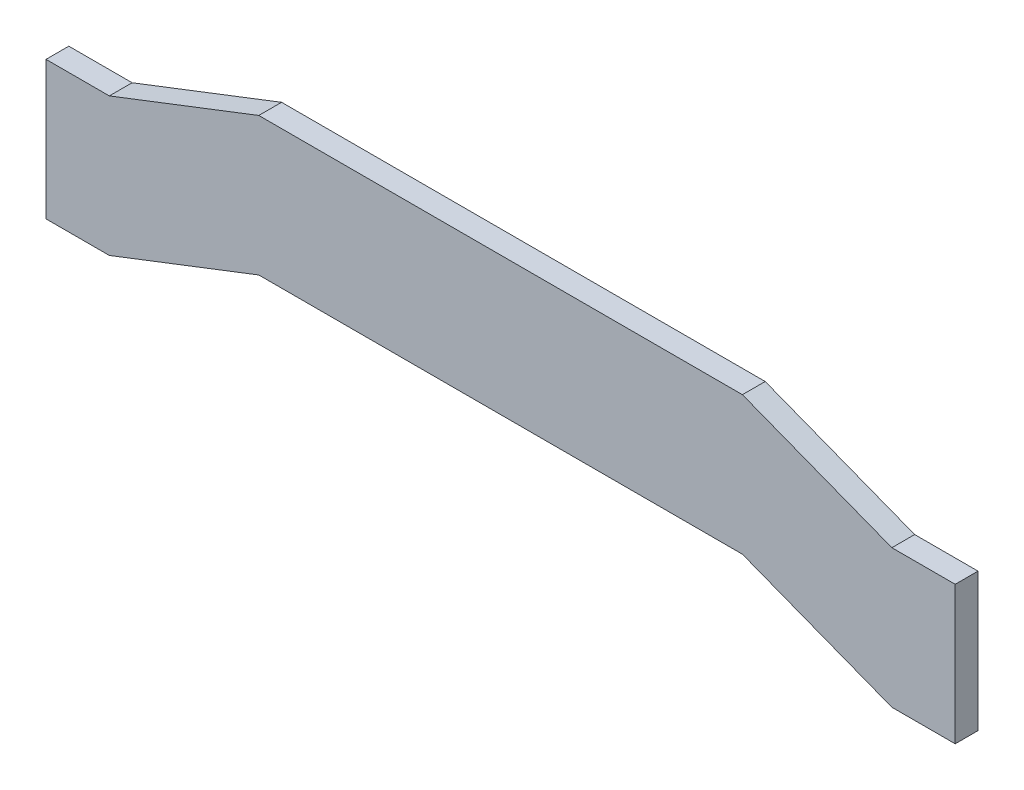
ISO-10303-21;
HEADER;
FILE_DESCRIPTION(('STEP AP214'),'2;1');
FILE_NAME('part.step','',(''),(''),'','','');
FILE_SCHEMA(('AUTOMOTIVE_DESIGN { 1 0 10303 214 1 1 1 1 }'));
ENDSEC;
DATA;
#1=APPLICATION_CONTEXT('core data for automotive mechanical design processes');
#2=APPLICATION_PROTOCOL_DEFINITION('international standard','automotive_design',2000,#1);
#3=PRODUCT_CONTEXT('',#1,'mechanical');
#4=PRODUCT('Part','Part','',(#3));
#5=PRODUCT_RELATED_PRODUCT_CATEGORY('part','',(#4));
#6=PRODUCT_DEFINITION_FORMATION('','',#4);
#7=PRODUCT_DEFINITION_CONTEXT('part definition',#1,'design');
#8=PRODUCT_DEFINITION('design','',#6,#7);
#9=PRODUCT_DEFINITION_SHAPE('','',#8);
#10=(LENGTH_UNIT() NAMED_UNIT(*) SI_UNIT(.MILLI.,.METRE.));
#11=(NAMED_UNIT(*) PLANE_ANGLE_UNIT() SI_UNIT($,.RADIAN.));
#12=(NAMED_UNIT(*) SI_UNIT($,.STERADIAN.) SOLID_ANGLE_UNIT());
#13=UNCERTAINTY_MEASURE_WITH_UNIT(LENGTH_MEASURE(1.E-05),#10,'distance_accuracy_value','');
#14=(GEOMETRIC_REPRESENTATION_CONTEXT(3) GLOBAL_UNCERTAINTY_ASSIGNED_CONTEXT((#13)) GLOBAL_UNIT_ASSIGNED_CONTEXT((#10,
#11,#12)) REPRESENTATION_CONTEXT('',''));
#15=CARTESIAN_POINT('',(0.,0.,0.));
#16=DIRECTION('',(0.,0.,1.));
#17=DIRECTION('',(1.,0.,0.));
#18=AXIS2_PLACEMENT_3D('',#15,#16,#17);
#19=CARTESIAN_POINT('',(-339.8,19.8,19.8));
#20=DIRECTION('',(-0.360711868380704,0.932677301111859,0.));
#21=DIRECTION('',(-0.932677301111859,-0.360711868380704,0.));
#22=AXIS2_PLACEMENT_3D('',#19,#20,#21);
#23=PLANE('',#22);
#24=DIRECTION('',(0.932677301111859,0.360711868380704,0.));
#25=VECTOR('',#24,1.);
#26=CARTESIAN_POINT('',(-339.8,19.8,0.));
#27=LINE('',#26,#25);
#28=CARTESIAN_POINT('',(-339.8,19.8,0.));
#29=VERTEX_POINT('',#28);
#30=CARTESIAN_POINT('',(-210.,70.,0.));
#31=VERTEX_POINT('',#30);
#32=EDGE_CURVE('E168',#29,#31,#27,.T.);
#33=ORIENTED_EDGE('',*,*,#32,.T.);
#34=DIRECTION('',(0.,0.,-1.));
#35=VECTOR('',#34,1.);
#36=CARTESIAN_POINT('',(-210.,70.,19.8));
#37=LINE('',#36,#35);
#38=CARTESIAN_POINT('',(-210.,70.,19.8));
#39=VERTEX_POINT('',#38);
#40=EDGE_CURVE('E11',#39,#31,#37,.T.);
#41=ORIENTED_EDGE('',*,*,#40,.F.);
#42=DIRECTION('',(0.932677301111859,0.360711868380704,0.));
#43=VECTOR('',#42,1.);
#44=CARTESIAN_POINT('',(-339.8,19.8,19.8));
#45=LINE('',#44,#43);
#46=CARTESIAN_POINT('',(-339.8,19.8,19.8));
#47=VERTEX_POINT('',#46);
#48=EDGE_CURVE('E202',#47,#39,#45,.T.);
#49=ORIENTED_EDGE('',*,*,#48,.F.);
#50=DIRECTION('',(0.,0.,-1.));
#51=VECTOR('',#50,1.);
#52=CARTESIAN_POINT('',(-339.8,19.8,19.8));
#53=LINE('',#52,#51);
#54=EDGE_CURVE('E164',#47,#29,#53,.T.);
#55=ORIENTED_EDGE('',*,*,#54,.T.);
#56=EDGE_LOOP('',(#33,#41,#49,#55));
#57=FACE_BOUND('',#56,.T.);
#58=ADVANCED_FACE('F43',(#57),#23,.F.);
#59=CARTESIAN_POINT('',(-210.,70.,19.8));
#60=DIRECTION('',(0.,1.,0.));
#61=DIRECTION('',(-1.,0.,0.));
#62=AXIS2_PLACEMENT_3D('',#59,#60,#61);
#63=PLANE('',#62);
#64=DIRECTION('',(1.,0.,0.));
#65=VECTOR('',#64,1.);
#66=CARTESIAN_POINT('',(-210.,70.,0.));
#67=LINE('',#66,#65);
#68=CARTESIAN_POINT('',(210.,70.0000000000001,0.));
#69=VERTEX_POINT('',#68);
#70=EDGE_CURVE('E172',#31,#69,#67,.T.);
#71=ORIENTED_EDGE('',*,*,#70,.T.);
#72=DIRECTION('',(0.,0.,-1.));
#73=VECTOR('',#72,1.);
#74=CARTESIAN_POINT('',(210.,70.0000000000001,19.8));
#75=LINE('',#74,#73);
#76=CARTESIAN_POINT('',(210.,70.0000000000001,19.8));
#77=VERTEX_POINT('',#76);
#78=EDGE_CURVE('E52',#77,#69,#75,.T.);
#79=ORIENTED_EDGE('',*,*,#78,.F.);
#80=DIRECTION('',(1.,0.,0.));
#81=VECTOR('',#80,1.);
#82=CARTESIAN_POINT('',(-210.,70.,19.8));
#83=LINE('',#82,#81);
#84=EDGE_CURVE('E115',#39,#77,#83,.T.);
#85=ORIENTED_EDGE('',*,*,#84,.F.);
#86=ORIENTED_EDGE('',*,*,#40,.T.);
#87=EDGE_LOOP('',(#71,#79,#85,#86));
#88=FACE_BOUND('',#87,.T.);
#89=ADVANCED_FACE('F296',(#88),#63,.F.);
#90=CARTESIAN_POINT('',(339.8,19.8,19.8));
#91=DIRECTION('',(0.360711868380704,0.932677301111859,0.));
#92=DIRECTION('',(-0.932677301111859,0.360711868380704,0.));
#93=AXIS2_PLACEMENT_3D('',#90,#91,#92);
#94=PLANE('',#93);
#95=DIRECTION('',(0.932677301111859,-0.360711868380704,0.));
#96=VECTOR('',#95,1.);
#97=CARTESIAN_POINT('',(339.8,19.8,0.));
#98=LINE('',#97,#96);
#99=CARTESIAN_POINT('',(339.8,19.8,0.));
#100=VERTEX_POINT('',#99);
#101=EDGE_CURVE('E175',#69,#100,#98,.T.);
#102=ORIENTED_EDGE('',*,*,#101,.T.);
#103=DIRECTION('',(0.,0.,-1.));
#104=VECTOR('',#103,1.);
#105=CARTESIAN_POINT('',(339.8,19.8,19.8));
#106=LINE('',#105,#104);
#107=CARTESIAN_POINT('',(339.8,19.8,19.8));
#108=VERTEX_POINT('',#107);
#109=EDGE_CURVE('E229',#108,#100,#106,.T.);
#110=ORIENTED_EDGE('',*,*,#109,.F.);
#111=DIRECTION('',(0.932677301111859,-0.360711868380704,0.));
#112=VECTOR('',#111,1.);
#113=CARTESIAN_POINT('',(339.8,19.8,19.8));
#114=LINE('',#113,#112);
#115=EDGE_CURVE('E239',#77,#108,#114,.T.);
#116=ORIENTED_EDGE('',*,*,#115,.F.);
#117=ORIENTED_EDGE('',*,*,#78,.T.);
#118=EDGE_LOOP('',(#102,#110,#116,#117));
#119=FACE_BOUND('',#118,.T.);
#120=ADVANCED_FACE('F237',(#119),#94,.F.);
#121=CARTESIAN_POINT('',(394.8,19.8,19.8));
#122=DIRECTION('',(0.,1.,0.));
#123=DIRECTION('',(-1.,0.,0.));
#124=AXIS2_PLACEMENT_3D('',#121,#122,#123);
#125=PLANE('',#124);
#126=DIRECTION('',(1.,0.,0.));
#127=VECTOR('',#126,1.);
#128=CARTESIAN_POINT('',(394.8,19.8,0.));
#129=LINE('',#128,#127);
#130=CARTESIAN_POINT('',(394.8,19.8,0.));
#131=VERTEX_POINT('',#130);
#132=EDGE_CURVE('E178',#100,#131,#129,.T.);
#133=ORIENTED_EDGE('',*,*,#132,.T.);
#134=DIRECTION('',(0.,0.,-1.));
#135=VECTOR('',#134,1.);
#136=CARTESIAN_POINT('',(394.8,19.8,19.8));
#137=LINE('',#136,#135);
#138=CARTESIAN_POINT('',(394.8,19.8,19.8));
#139=VERTEX_POINT('',#138);
#140=EDGE_CURVE('E225',#139,#131,#137,.T.);
#141=ORIENTED_EDGE('',*,*,#140,.F.);
#142=DIRECTION('',(1.,0.,0.));
#143=VECTOR('',#142,1.);
#144=CARTESIAN_POINT('',(394.8,19.8,19.8));
#145=LINE('',#144,#143);
#146=EDGE_CURVE('E258',#108,#139,#145,.T.);
#147=ORIENTED_EDGE('',*,*,#146,.F.);
#148=ORIENTED_EDGE('',*,*,#109,.T.);
#149=EDGE_LOOP('',(#133,#141,#147,#148));
#150=FACE_BOUND('',#149,.T.);
#151=ADVANCED_FACE('F248',(#150),#125,.F.);
#152=CARTESIAN_POINT('',(394.8,19.8,19.8));
#153=DIRECTION('',(-1.,0.,0.));
#154=DIRECTION('',(0.,-1.,0.));
#155=AXIS2_PLACEMENT_3D('',#152,#153,#154);
#156=PLANE('',#155);
#157=DIRECTION('',(0.,1.,0.));
#158=VECTOR('',#157,1.);
#159=CARTESIAN_POINT('',(394.8,19.8,0.));
#160=LINE('',#159,#158);
#161=CARTESIAN_POINT('',(394.8,139.8,0.));
#162=VERTEX_POINT('',#161);
#163=EDGE_CURVE('E181',#131,#162,#160,.T.);
#164=ORIENTED_EDGE('',*,*,#163,.T.);
#165=DIRECTION('',(0.,0.,-1.));
#166=VECTOR('',#165,1.);
#167=CARTESIAN_POINT('',(394.8,139.8,19.8));
#168=LINE('',#167,#166);
#169=CARTESIAN_POINT('',(394.8,139.8,19.8));
#170=VERTEX_POINT('',#169);
#171=EDGE_CURVE('E221',#170,#162,#168,.T.);
#172=ORIENTED_EDGE('',*,*,#171,.F.);
#173=DIRECTION('',(0.,1.,0.));
#174=VECTOR('',#173,1.);
#175=CARTESIAN_POINT('',(394.8,19.8,19.8));
#176=LINE('',#175,#174);
#177=EDGE_CURVE('E254',#139,#170,#176,.T.);
#178=ORIENTED_EDGE('',*,*,#177,.F.);
#179=ORIENTED_EDGE('',*,*,#140,.T.);
#180=EDGE_LOOP('',(#164,#172,#178,#179));
#181=FACE_BOUND('',#180,.T.);
#182=ADVANCED_FACE('F252',(#181),#156,.F.);
#183=CARTESIAN_POINT('',(394.8,139.8,19.8));
#184=DIRECTION('',(0.,-1.,0.));
#185=DIRECTION('',(1.,0.,0.));
#186=AXIS2_PLACEMENT_3D('',#183,#184,#185);
#187=PLANE('',#186);
#188=DIRECTION('',(-1.,0.,0.));
#189=VECTOR('',#188,1.);
#190=CARTESIAN_POINT('',(394.8,139.8,0.));
#191=LINE('',#190,#189);
#192=CARTESIAN_POINT('',(339.8,139.8,0.));
#193=VERTEX_POINT('',#192);
#194=EDGE_CURVE('E184',#162,#193,#191,.T.);
#195=ORIENTED_EDGE('',*,*,#194,.T.);
#196=DIRECTION('',(0.,0.,-1.));
#197=VECTOR('',#196,1.);
#198=CARTESIAN_POINT('',(339.8,139.8,19.8));
#199=LINE('',#198,#197);
#200=CARTESIAN_POINT('',(339.8,139.8,19.8));
#201=VERTEX_POINT('',#200);
#202=EDGE_CURVE('E217',#201,#193,#199,.T.);
#203=ORIENTED_EDGE('',*,*,#202,.F.);
#204=DIRECTION('',(-1.,0.,0.));
#205=VECTOR('',#204,1.);
#206=CARTESIAN_POINT('',(394.8,139.8,19.8));
#207=LINE('',#206,#205);
#208=EDGE_CURVE('E257',#170,#201,#207,.T.);
#209=ORIENTED_EDGE('',*,*,#208,.F.);
#210=ORIENTED_EDGE('',*,*,#171,.T.);
#211=EDGE_LOOP('',(#195,#203,#209,#210));
#212=FACE_BOUND('',#211,.T.);
#213=ADVANCED_FACE('F309',(#212),#187,.F.);
#214=CARTESIAN_POINT('',(339.8,139.8,19.8));
#215=DIRECTION('',(-0.360711868380705,-0.932677301111859,0.));
#216=DIRECTION('',(0.932677301111859,-0.360711868380705,0.));
#217=AXIS2_PLACEMENT_3D('',#214,#215,#216);
#218=PLANE('',#217);
#219=DIRECTION('',(-0.932677301111859,0.360711868380705,0.));
#220=VECTOR('',#219,1.);
#221=CARTESIAN_POINT('',(339.8,139.8,0.));
#222=LINE('',#221,#220);
#223=CARTESIAN_POINT('',(210.,190.,0.));
#224=VERTEX_POINT('',#223);
#225=EDGE_CURVE('E187',#193,#224,#222,.T.);
#226=ORIENTED_EDGE('',*,*,#225,.T.);
#227=DIRECTION('',(0.,0.,-1.));
#228=VECTOR('',#227,1.);
#229=CARTESIAN_POINT('',(210.,190.,19.8));
#230=LINE('',#229,#228);
#231=CARTESIAN_POINT('',(210.,190.,19.8));
#232=VERTEX_POINT('',#231);
#233=EDGE_CURVE('E213',#232,#224,#230,.T.);
#234=ORIENTED_EDGE('',*,*,#233,.F.);
#235=DIRECTION('',(-0.932677301111859,0.360711868380705,0.));
#236=VECTOR('',#235,1.);
#237=CARTESIAN_POINT('',(339.8,139.8,19.8));
#238=LINE('',#237,#236);
#239=EDGE_CURVE('E262',#201,#232,#238,.T.);
#240=ORIENTED_EDGE('',*,*,#239,.F.);
#241=ORIENTED_EDGE('',*,*,#202,.T.);
#242=EDGE_LOOP('',(#226,#234,#240,#241));
#243=FACE_BOUND('',#242,.T.);
#244=ADVANCED_FACE('F312',(#243),#218,.F.);
#245=CARTESIAN_POINT('',(210.,190.,19.8));
#246=DIRECTION('',(0.,-1.,0.));
#247=DIRECTION('',(1.,0.,0.));
#248=AXIS2_PLACEMENT_3D('',#245,#246,#247);
#249=PLANE('',#248);
#250=DIRECTION('',(-1.,0.,0.));
#251=VECTOR('',#250,1.);
#252=CARTESIAN_POINT('',(210.,190.,0.));
#253=LINE('',#252,#251);
#254=CARTESIAN_POINT('',(-210.,190.,0.));
#255=VERTEX_POINT('',#254);
#256=EDGE_CURVE('E190',#224,#255,#253,.T.);
#257=ORIENTED_EDGE('',*,*,#256,.T.);
#258=DIRECTION('',(0.,0.,-1.));
#259=VECTOR('',#258,1.);
#260=CARTESIAN_POINT('',(-210.,190.,19.8));
#261=LINE('',#260,#259);
#262=CARTESIAN_POINT('',(-210.,190.,19.8));
#263=VERTEX_POINT('',#262);
#264=EDGE_CURVE('E209',#263,#255,#261,.T.);
#265=ORIENTED_EDGE('',*,*,#264,.F.);
#266=DIRECTION('',(-1.,0.,0.));
#267=VECTOR('',#266,1.);
#268=CARTESIAN_POINT('',(210.,190.,19.8));
#269=LINE('',#268,#267);
#270=EDGE_CURVE('E269',#232,#263,#269,.T.);
#271=ORIENTED_EDGE('',*,*,#270,.F.);
#272=ORIENTED_EDGE('',*,*,#233,.T.);
#273=EDGE_LOOP('',(#257,#265,#271,#272));
#274=FACE_BOUND('',#273,.T.);
#275=ADVANCED_FACE('F277',(#274),#249,.F.);
#276=CARTESIAN_POINT('',(-339.8,139.8,19.8));
#277=DIRECTION('',(0.360711868380704,-0.932677301111859,0.));
#278=DIRECTION('',(0.932677301111859,0.360711868380704,0.));
#279=AXIS2_PLACEMENT_3D('',#276,#277,#278);
#280=PLANE('',#279);
#281=DIRECTION('',(-0.932677301111859,-0.360711868380704,0.));
#282=VECTOR('',#281,1.);
#283=CARTESIAN_POINT('',(-339.8,139.8,0.));
#284=LINE('',#283,#282);
#285=CARTESIAN_POINT('',(-339.8,139.8,0.));
#286=VERTEX_POINT('',#285);
#287=EDGE_CURVE('E193',#255,#286,#284,.T.);
#288=ORIENTED_EDGE('',*,*,#287,.T.);
#289=DIRECTION('',(0.,0.,-1.));
#290=VECTOR('',#289,1.);
#291=CARTESIAN_POINT('',(-339.8,139.8,19.8));
#292=LINE('',#291,#290);
#293=CARTESIAN_POINT('',(-339.8,139.8,19.8));
#294=VERTEX_POINT('',#293);
#295=EDGE_CURVE('E157',#294,#286,#292,.T.);
#296=ORIENTED_EDGE('',*,*,#295,.F.);
#297=DIRECTION('',(-0.932677301111859,-0.360711868380704,0.));
#298=VECTOR('',#297,1.);
#299=CARTESIAN_POINT('',(-339.8,139.8,19.8));
#300=LINE('',#299,#298);
#301=EDGE_CURVE('E146',#263,#294,#300,.T.);
#302=ORIENTED_EDGE('',*,*,#301,.F.);
#303=ORIENTED_EDGE('',*,*,#264,.T.);
#304=EDGE_LOOP('',(#288,#296,#302,#303));
#305=FACE_BOUND('',#304,.T.);
#306=ADVANCED_FACE('F281',(#305),#280,.F.);
#307=CARTESIAN_POINT('',(-394.8,139.8,19.8));
#308=DIRECTION('',(0.,-1.,0.));
#309=DIRECTION('',(0.,0.,-1.));
#310=AXIS2_PLACEMENT_3D('',#307,#308,#309);
#311=PLANE('',#310);
#312=DIRECTION('',(-1.,0.,0.));
#313=VECTOR('',#312,1.);
#314=CARTESIAN_POINT('',(-394.8,139.8,0.));
#315=LINE('',#314,#313);
#316=CARTESIAN_POINT('',(-394.8,139.8,0.));
#317=VERTEX_POINT('',#316);
#318=EDGE_CURVE('E155',#286,#317,#315,.T.);
#319=ORIENTED_EDGE('',*,*,#318,.T.);
#320=DIRECTION('',(0.,0.,-1.));
#321=VECTOR('',#320,1.);
#322=CARTESIAN_POINT('',(-394.8,139.8,19.8));
#323=LINE('',#322,#321);
#324=CARTESIAN_POINT('',(-394.8,139.8,19.8));
#325=VERTEX_POINT('',#324);
#326=EDGE_CURVE('E152',#325,#317,#323,.T.);
#327=ORIENTED_EDGE('',*,*,#326,.F.);
#328=DIRECTION('',(-1.,0.,0.));
#329=VECTOR('',#328,1.);
#330=CARTESIAN_POINT('',(-394.8,139.8,19.8));
#331=LINE('',#330,#329);
#332=EDGE_CURVE('E140',#294,#325,#331,.T.);
#333=ORIENTED_EDGE('',*,*,#332,.F.);
#334=ORIENTED_EDGE('',*,*,#295,.T.);
#335=EDGE_LOOP('',(#319,#327,#333,#334));
#336=FACE_BOUND('',#335,.T.);
#337=ADVANCED_FACE('F153',(#336),#311,.F.);
#338=CARTESIAN_POINT('',(-394.8,139.8,19.8));
#339=DIRECTION('',(1.,0.,0.));
#340=DIRECTION('',(0.,1.,0.));
#341=AXIS2_PLACEMENT_3D('',#338,#339,#340);
#342=PLANE('',#341);
#343=DIRECTION('',(0.,-1.,0.));
#344=VECTOR('',#343,1.);
#345=CARTESIAN_POINT('',(-394.8,139.8,0.));
#346=LINE('',#345,#344);
#347=CARTESIAN_POINT('',(-394.8,19.8,0.));
#348=VERTEX_POINT('',#347);
#349=EDGE_CURVE('E101',#317,#348,#346,.T.);
#350=ORIENTED_EDGE('',*,*,#349,.T.);
#351=DIRECTION('',(0.,0.,-1.));
#352=VECTOR('',#351,1.);
#353=CARTESIAN_POINT('',(-394.8,19.8,19.8));
#354=LINE('',#353,#352);
#355=CARTESIAN_POINT('',(-394.8,19.8,19.8));
#356=VERTEX_POINT('',#355);
#357=EDGE_CURVE('E158',#356,#348,#354,.T.);
#358=ORIENTED_EDGE('',*,*,#357,.F.);
#359=DIRECTION('',(0.,-1.,0.));
#360=VECTOR('',#359,1.);
#361=CARTESIAN_POINT('',(-394.8,139.8,19.8));
#362=LINE('',#361,#360);
#363=EDGE_CURVE('E144',#325,#356,#362,.T.);
#364=ORIENTED_EDGE('',*,*,#363,.F.);
#365=ORIENTED_EDGE('',*,*,#326,.T.);
#366=EDGE_LOOP('',(#350,#358,#364,#365));
#367=FACE_BOUND('',#366,.T.);
#368=ADVANCED_FACE('F160',(#367),#342,.F.);
#369=CARTESIAN_POINT('',(-394.8,19.8,19.8));
#370=DIRECTION('',(0.,1.,0.));
#371=DIRECTION('',(-1.,0.,0.));
#372=AXIS2_PLACEMENT_3D('',#369,#370,#371);
#373=PLANE('',#372);
#374=DIRECTION('',(1.,0.,0.));
#375=VECTOR('',#374,1.);
#376=CARTESIAN_POINT('',(-394.8,19.8,0.));
#377=LINE('',#376,#375);
#378=EDGE_CURVE('E107',#348,#29,#377,.T.);
#379=ORIENTED_EDGE('',*,*,#378,.T.);
#380=ORIENTED_EDGE('',*,*,#54,.F.);
#381=DIRECTION('',(1.,0.,0.));
#382=VECTOR('',#381,1.);
#383=CARTESIAN_POINT('',(-394.8,19.8,19.8));
#384=LINE('',#383,#382);
#385=EDGE_CURVE('E60',#356,#47,#384,.T.);
#386=ORIENTED_EDGE('',*,*,#385,.F.);
#387=ORIENTED_EDGE('',*,*,#357,.T.);
#388=EDGE_LOOP('',(#379,#380,#386,#387));
#389=FACE_BOUND('',#388,.T.);
#390=ADVANCED_FACE('F285',(#389),#373,.F.);
#391=CARTESIAN_POINT('',(0.,0.,19.8));
#392=DIRECTION('',(0.,0.,1.));
#393=DIRECTION('',(1.,0.,0.));
#394=AXIS2_PLACEMENT_3D('',#391,#392,#393);
#395=PLANE('',#394);
#396=ORIENTED_EDGE('',*,*,#48,.T.);
#397=ORIENTED_EDGE('',*,*,#84,.T.);
#398=ORIENTED_EDGE('',*,*,#115,.T.);
#399=ORIENTED_EDGE('',*,*,#146,.T.);
#400=ORIENTED_EDGE('',*,*,#177,.T.);
#401=ORIENTED_EDGE('',*,*,#208,.T.);
#402=ORIENTED_EDGE('',*,*,#239,.T.);
#403=ORIENTED_EDGE('',*,*,#270,.T.);
#404=ORIENTED_EDGE('',*,*,#301,.T.);
#405=ORIENTED_EDGE('',*,*,#332,.T.);
#406=ORIENTED_EDGE('',*,*,#363,.T.);
#407=ORIENTED_EDGE('',*,*,#385,.T.);
#408=EDGE_LOOP('',(#396,#397,#398,#399,#400,#401,#402,#403,#404,#405,#406,#407));
#409=FACE_BOUND('',#408,.T.);
#410=ADVANCED_FACE('F142',(#409),#395,.T.);
#411=CARTESIAN_POINT('',(0.,0.,0.));
#412=DIRECTION('',(0.,0.,1.));
#413=DIRECTION('',(1.,0.,0.));
#414=AXIS2_PLACEMENT_3D('',#411,#412,#413);
#415=PLANE('',#414);
#416=ORIENTED_EDGE('',*,*,#32,.F.);
#417=ORIENTED_EDGE('',*,*,#378,.F.);
#418=ORIENTED_EDGE('',*,*,#349,.F.);
#419=ORIENTED_EDGE('',*,*,#318,.F.);
#420=ORIENTED_EDGE('',*,*,#287,.F.);
#421=ORIENTED_EDGE('',*,*,#256,.F.);
#422=ORIENTED_EDGE('',*,*,#225,.F.);
#423=ORIENTED_EDGE('',*,*,#194,.F.);
#424=ORIENTED_EDGE('',*,*,#163,.F.);
#425=ORIENTED_EDGE('',*,*,#132,.F.);
#426=ORIENTED_EDGE('',*,*,#101,.F.);
#427=ORIENTED_EDGE('',*,*,#70,.F.);
#428=EDGE_LOOP('',(#416,#417,#418,#419,#420,#421,#422,#423,#424,#425,#426,#427));
#429=FACE_BOUND('',#428,.T.);
#430=ADVANCED_FACE('F243',(#429),#415,.F.);
#431=CLOSED_SHELL('',(#58,#89,#120,#151,#182,#213,#244,#275,#306,#337,#368,#390,#410,#430));
#432=MANIFOLD_SOLID_BREP('B2',#431);
#433=ADVANCED_BREP_SHAPE_REPRESENTATION('',(#18,#432),#14);
#434=SHAPE_DEFINITION_REPRESENTATION(#9,#433);
ENDSEC;
END-ISO-10303-21;
